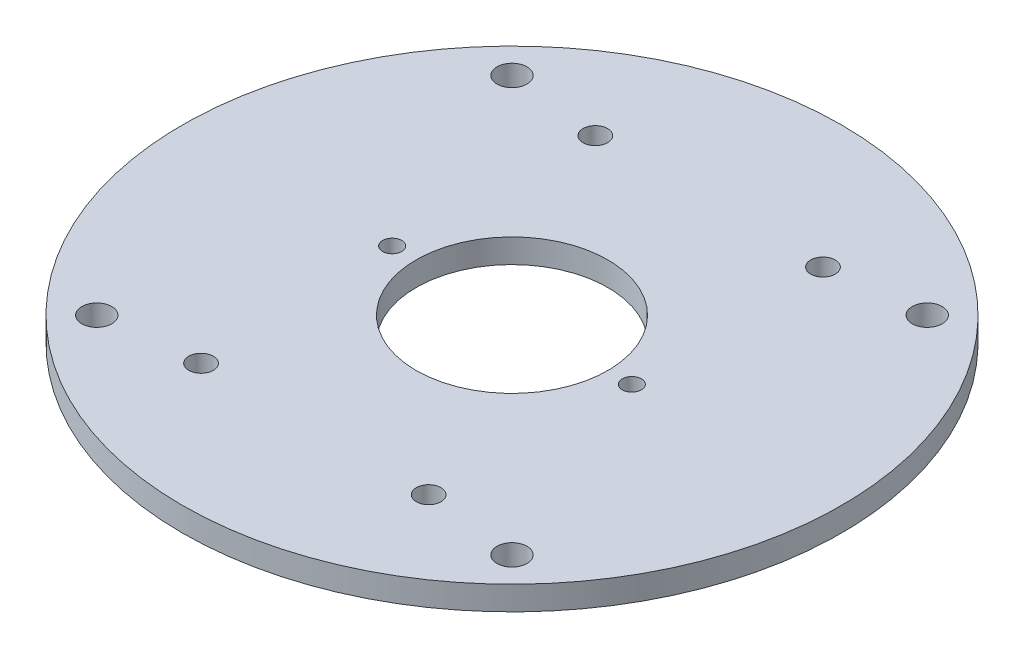
ISO-10303-21;
HEADER;
FILE_DESCRIPTION(('STEP AP214'),'2;1');
FILE_NAME('part.step','',(''),(''),'','','');
FILE_SCHEMA(('AUTOMOTIVE_DESIGN { 1 0 10303 214 1 1 1 1 }'));
ENDSEC;
DATA;
#1=APPLICATION_CONTEXT('core data for automotive mechanical design processes');
#2=APPLICATION_PROTOCOL_DEFINITION('international standard','automotive_design',2000,#1);
#3=PRODUCT_CONTEXT('',#1,'mechanical');
#4=PRODUCT('Part','Part','',(#3));
#5=PRODUCT_RELATED_PRODUCT_CATEGORY('part','',(#4));
#6=PRODUCT_DEFINITION_FORMATION('','',#4);
#7=PRODUCT_DEFINITION_CONTEXT('part definition',#1,'design');
#8=PRODUCT_DEFINITION('design','',#6,#7);
#9=PRODUCT_DEFINITION_SHAPE('','',#8);
#10=(LENGTH_UNIT() NAMED_UNIT(*) SI_UNIT(.MILLI.,.METRE.));
#11=(NAMED_UNIT(*) PLANE_ANGLE_UNIT() SI_UNIT($,.RADIAN.));
#12=(NAMED_UNIT(*) SI_UNIT($,.STERADIAN.) SOLID_ANGLE_UNIT());
#13=UNCERTAINTY_MEASURE_WITH_UNIT(LENGTH_MEASURE(1.E-05),#10,'distance_accuracy_value','');
#14=(GEOMETRIC_REPRESENTATION_CONTEXT(3) GLOBAL_UNCERTAINTY_ASSIGNED_CONTEXT((#13)) GLOBAL_UNIT_ASSIGNED_CONTEXT((#10,
#11,#12)) REPRESENTATION_CONTEXT('',''));
#15=CARTESIAN_POINT('',(0.,0.,0.));
#16=DIRECTION('',(0.,0.,1.));
#17=DIRECTION('',(1.,0.,0.));
#18=AXIS2_PLACEMENT_3D('',#15,#16,#17);
#19=CARTESIAN_POINT('',(0.,2.,0.));
#20=DIRECTION('',(0.,-1.,0.));
#21=DIRECTION('',(0.,0.,-1.));
#22=AXIS2_PLACEMENT_3D('',#19,#20,#21);
#23=CYLINDRICAL_SURFACE('',#22,27.5);
#24=CARTESIAN_POINT('',(0.,2.,0.));
#25=DIRECTION('',(0.,1.,0.));
#26=DIRECTION('',(0.,0.,1.));
#27=AXIS2_PLACEMENT_3D('',#24,#25,#26);
#28=CIRCLE('',#27,27.5);
#29=CARTESIAN_POINT('',(0.,2.,27.5));
#30=VERTEX_POINT('',#29);
#31=EDGE_CURVE('E10',#30,#30,#28,.T.);
#32=ORIENTED_EDGE('',*,*,#31,.F.);
#33=EDGE_LOOP('',(#32));
#34=FACE_BOUND('',#33,.T.);
#35=CARTESIAN_POINT('',(0.,0.,0.));
#36=DIRECTION('',(0.,1.,0.));
#37=DIRECTION('',(0.,0.,1.));
#38=AXIS2_PLACEMENT_3D('',#35,#36,#37);
#39=CIRCLE('',#38,27.5);
#40=CARTESIAN_POINT('',(0.,0.,27.5));
#41=VERTEX_POINT('',#40);
#42=EDGE_CURVE('E37',#41,#41,#39,.T.);
#43=ORIENTED_EDGE('',*,*,#42,.T.);
#44=EDGE_LOOP('',(#43));
#45=FACE_BOUND('',#44,.T.);
#46=ADVANCED_FACE('F34',(#34,#45),#23,.T.);
#47=CARTESIAN_POINT('',(0.,2.,0.));
#48=DIRECTION('',(0.,1.,0.));
#49=DIRECTION('',(0.,0.,1.));
#50=AXIS2_PLACEMENT_3D('',#47,#48,#49);
#51=PLANE('',#50);
#52=CARTESIAN_POINT('',(-9.49708846877382,2.,16.4516810878488));
#53=DIRECTION('',(0.,1.,0.));
#54=DIRECTION('',(0.,0.,1.));
#55=AXIS2_PLACEMENT_3D('',#52,#53,#54);
#56=CIRCLE('',#55,1.025);
#57=CARTESIAN_POINT('',(-9.49708846877382,2.,17.4766810878488));
#58=VERTEX_POINT('',#57);
#59=EDGE_CURVE('E108',#58,#58,#56,.T.);
#60=ORIENTED_EDGE('',*,*,#59,.F.);
#61=EDGE_LOOP('',(#60));
#62=FACE_BOUND('',#61,.T.);
#63=CARTESIAN_POINT('',(9.49708846877383,2.,16.4516810878489));
#64=DIRECTION('',(0.,1.,0.));
#65=DIRECTION('',(0.,0.,1.));
#66=AXIS2_PLACEMENT_3D('',#63,#64,#65);
#67=CIRCLE('',#66,1.025);
#68=CARTESIAN_POINT('',(9.49708846877383,2.,17.4766810878488));
#69=VERTEX_POINT('',#68);
#70=EDGE_CURVE('E102',#69,#69,#67,.T.);
#71=ORIENTED_EDGE('',*,*,#70,.F.);
#72=EDGE_LOOP('',(#71));
#73=FACE_BOUND('',#72,.T.);
#74=CARTESIAN_POINT('',(-9.49708846877382,2.,-16.4516810878488));
#75=DIRECTION('',(0.,1.,0.));
#76=DIRECTION('',(0.,0.,1.));
#77=AXIS2_PLACEMENT_3D('',#74,#75,#76);
#78=CIRCLE('',#77,1.025);
#79=CARTESIAN_POINT('',(-9.49708846877382,2.,-15.4266810878488));
#80=VERTEX_POINT('',#79);
#81=EDGE_CURVE('E96',#80,#80,#78,.T.);
#82=ORIENTED_EDGE('',*,*,#81,.F.);
#83=EDGE_LOOP('',(#82));
#84=FACE_BOUND('',#83,.T.);
#85=CARTESIAN_POINT('',(9.49708846877383,2.,-16.4516810878489));
#86=DIRECTION('',(0.,1.,0.));
#87=DIRECTION('',(0.,0.,1.));
#88=AXIS2_PLACEMENT_3D('',#85,#86,#87);
#89=CIRCLE('',#88,1.025);
#90=CARTESIAN_POINT('',(9.49708846877383,2.,-15.4266810878488));
#91=VERTEX_POINT('',#90);
#92=EDGE_CURVE('E90',#91,#91,#89,.T.);
#93=ORIENTED_EDGE('',*,*,#92,.F.);
#94=EDGE_LOOP('',(#93));
#95=FACE_BOUND('',#94,.T.);
#96=CARTESIAN_POINT('',(10.,2.,0.));
#97=DIRECTION('',(0.,1.,0.));
#98=DIRECTION('',(0.,0.,1.));
#99=AXIS2_PLACEMENT_3D('',#96,#97,#98);
#100=CIRCLE('',#99,0.8);
#101=CARTESIAN_POINT('',(10.,2.,0.8));
#102=VERTEX_POINT('',#101);
#103=EDGE_CURVE('E84',#102,#102,#100,.T.);
#104=ORIENTED_EDGE('',*,*,#103,.F.);
#105=EDGE_LOOP('',(#104));
#106=FACE_BOUND('',#105,.T.);
#107=CARTESIAN_POINT('',(-17.3241161390703,2.,17.3241161390705));
#108=DIRECTION('',(0.,1.,0.));
#109=DIRECTION('',(0.,0.,1.));
#110=AXIS2_PLACEMENT_3D('',#107,#108,#109);
#111=CIRCLE('',#110,1.24999999999999);
#112=CARTESIAN_POINT('',(-17.3241161390703,2.,18.5741161390705));
#113=VERTEX_POINT('',#112);
#114=EDGE_CURVE('E78',#113,#113,#111,.T.);
#115=ORIENTED_EDGE('',*,*,#114,.F.);
#116=EDGE_LOOP('',(#115));
#117=FACE_BOUND('',#116,.T.);
#118=CARTESIAN_POINT('',(17.3241161390703,2.,17.3241161390705));
#119=DIRECTION('',(0.,1.,0.));
#120=DIRECTION('',(0.,0.,1.));
#121=AXIS2_PLACEMENT_3D('',#118,#119,#120);
#122=CIRCLE('',#121,1.24999999999999);
#123=CARTESIAN_POINT('',(17.3241161390703,2.,18.5741161390705));
#124=VERTEX_POINT('',#123);
#125=EDGE_CURVE('E72',#124,#124,#122,.T.);
#126=ORIENTED_EDGE('',*,*,#125,.F.);
#127=EDGE_LOOP('',(#126));
#128=FACE_BOUND('',#127,.T.);
#129=CARTESIAN_POINT('',(17.3241161390703,2.,-17.3241161390705));
#130=DIRECTION('',(0.,1.,0.));
#131=DIRECTION('',(0.,0.,1.));
#132=AXIS2_PLACEMENT_3D('',#129,#130,#131);
#133=CIRCLE('',#132,1.24999999999999);
#134=CARTESIAN_POINT('',(17.3241161390703,2.,-16.0741161390705));
#135=VERTEX_POINT('',#134);
#136=EDGE_CURVE('E66',#135,#135,#133,.T.);
#137=ORIENTED_EDGE('',*,*,#136,.F.);
#138=EDGE_LOOP('',(#137));
#139=FACE_BOUND('',#138,.T.);
#140=CARTESIAN_POINT('',(-17.3241161390703,2.,-17.3241161390705));
#141=DIRECTION('',(0.,1.,0.));
#142=DIRECTION('',(0.,0.,1.));
#143=AXIS2_PLACEMENT_3D('',#140,#141,#142);
#144=CIRCLE('',#143,1.24999999999999);
#145=CARTESIAN_POINT('',(-17.3241161390703,2.,-16.0741161390705));
#146=VERTEX_POINT('',#145);
#147=EDGE_CURVE('E60',#146,#146,#144,.T.);
#148=ORIENTED_EDGE('',*,*,#147,.F.);
#149=EDGE_LOOP('',(#148));
#150=FACE_BOUND('',#149,.T.);
#151=CARTESIAN_POINT('',(-10.,2.,0.));
#152=DIRECTION('',(0.,1.,0.));
#153=DIRECTION('',(0.,0.,1.));
#154=AXIS2_PLACEMENT_3D('',#151,#152,#153);
#155=CIRCLE('',#154,0.8);
#156=CARTESIAN_POINT('',(-10.,2.,0.8));
#157=VERTEX_POINT('',#156);
#158=EDGE_CURVE('E54',#157,#157,#155,.T.);
#159=ORIENTED_EDGE('',*,*,#158,.F.);
#160=EDGE_LOOP('',(#159));
#161=FACE_BOUND('',#160,.T.);
#162=CARTESIAN_POINT('',(0.,2.,0.));
#163=DIRECTION('',(0.,1.,0.));
#164=DIRECTION('',(0.,0.,1.));
#165=AXIS2_PLACEMENT_3D('',#162,#163,#164);
#166=CIRCLE('',#165,8.);
#167=CARTESIAN_POINT('',(0.,2.,8.));
#168=VERTEX_POINT('',#167);
#169=EDGE_CURVE('E46',#168,#168,#166,.T.);
#170=ORIENTED_EDGE('',*,*,#169,.F.);
#171=EDGE_LOOP('',(#170));
#172=FACE_BOUND('',#171,.T.);
#173=ORIENTED_EDGE('',*,*,#31,.T.);
#174=EDGE_LOOP('',(#173));
#175=FACE_BOUND('',#174,.T.);
#176=ADVANCED_FACE('F114',(#62,#73,#84,#95,#106,#117,#128,#139,#150,#161,#172,#175),#51,.T.);
#177=CARTESIAN_POINT('',(0.,0.,0.));
#178=DIRECTION('',(0.,1.,0.));
#179=DIRECTION('',(0.,0.,1.));
#180=AXIS2_PLACEMENT_3D('',#177,#178,#179);
#181=PLANE('',#180);
#182=CARTESIAN_POINT('',(-9.49708846877382,0.,16.4516810878488));
#183=DIRECTION('',(0.,1.,0.));
#184=DIRECTION('',(0.,0.,1.));
#185=AXIS2_PLACEMENT_3D('',#182,#183,#184);
#186=CIRCLE('',#185,1.025);
#187=CARTESIAN_POINT('',(-9.49708846877382,0.,17.4766810878488));
#188=VERTEX_POINT('',#187);
#189=EDGE_CURVE('E105',#188,#188,#186,.T.);
#190=ORIENTED_EDGE('',*,*,#189,.T.);
#191=EDGE_LOOP('',(#190));
#192=FACE_BOUND('',#191,.T.);
#193=CARTESIAN_POINT('',(9.49708846877383,0.,16.4516810878489));
#194=DIRECTION('',(0.,1.,0.));
#195=DIRECTION('',(0.,0.,1.));
#196=AXIS2_PLACEMENT_3D('',#193,#194,#195);
#197=CIRCLE('',#196,1.025);
#198=CARTESIAN_POINT('',(9.49708846877383,0.,17.4766810878488));
#199=VERTEX_POINT('',#198);
#200=EDGE_CURVE('E99',#199,#199,#197,.T.);
#201=ORIENTED_EDGE('',*,*,#200,.T.);
#202=EDGE_LOOP('',(#201));
#203=FACE_BOUND('',#202,.T.);
#204=CARTESIAN_POINT('',(-9.49708846877382,0.,-16.4516810878488));
#205=DIRECTION('',(0.,1.,0.));
#206=DIRECTION('',(0.,0.,1.));
#207=AXIS2_PLACEMENT_3D('',#204,#205,#206);
#208=CIRCLE('',#207,1.025);
#209=CARTESIAN_POINT('',(-9.49708846877382,0.,-15.4266810878488));
#210=VERTEX_POINT('',#209);
#211=EDGE_CURVE('E93',#210,#210,#208,.T.);
#212=ORIENTED_EDGE('',*,*,#211,.T.);
#213=EDGE_LOOP('',(#212));
#214=FACE_BOUND('',#213,.T.);
#215=CARTESIAN_POINT('',(9.49708846877383,0.,-16.4516810878489));
#216=DIRECTION('',(0.,1.,0.));
#217=DIRECTION('',(0.,0.,1.));
#218=AXIS2_PLACEMENT_3D('',#215,#216,#217);
#219=CIRCLE('',#218,1.025);
#220=CARTESIAN_POINT('',(9.49708846877383,0.,-15.4266810878488));
#221=VERTEX_POINT('',#220);
#222=EDGE_CURVE('E87',#221,#221,#219,.T.);
#223=ORIENTED_EDGE('',*,*,#222,.T.);
#224=EDGE_LOOP('',(#223));
#225=FACE_BOUND('',#224,.T.);
#226=CARTESIAN_POINT('',(10.,0.,0.));
#227=DIRECTION('',(0.,1.,0.));
#228=DIRECTION('',(0.,0.,1.));
#229=AXIS2_PLACEMENT_3D('',#226,#227,#228);
#230=CIRCLE('',#229,0.8);
#231=CARTESIAN_POINT('',(10.,0.,0.8));
#232=VERTEX_POINT('',#231);
#233=EDGE_CURVE('E81',#232,#232,#230,.T.);
#234=ORIENTED_EDGE('',*,*,#233,.T.);
#235=EDGE_LOOP('',(#234));
#236=FACE_BOUND('',#235,.T.);
#237=CARTESIAN_POINT('',(-17.3241161390703,0.,17.3241161390705));
#238=DIRECTION('',(0.,1.,0.));
#239=DIRECTION('',(0.,0.,1.));
#240=AXIS2_PLACEMENT_3D('',#237,#238,#239);
#241=CIRCLE('',#240,1.25);
#242=CARTESIAN_POINT('',(-17.3241161390703,0.,18.5741161390705));
#243=VERTEX_POINT('',#242);
#244=EDGE_CURVE('E75',#243,#243,#241,.T.);
#245=ORIENTED_EDGE('',*,*,#244,.T.);
#246=EDGE_LOOP('',(#245));
#247=FACE_BOUND('',#246,.T.);
#248=CARTESIAN_POINT('',(17.3241161390703,0.,17.3241161390705));
#249=DIRECTION('',(0.,1.,0.));
#250=DIRECTION('',(0.,0.,1.));
#251=AXIS2_PLACEMENT_3D('',#248,#249,#250);
#252=CIRCLE('',#251,1.25);
#253=CARTESIAN_POINT('',(17.3241161390703,0.,18.5741161390705));
#254=VERTEX_POINT('',#253);
#255=EDGE_CURVE('E69',#254,#254,#252,.T.);
#256=ORIENTED_EDGE('',*,*,#255,.T.);
#257=EDGE_LOOP('',(#256));
#258=FACE_BOUND('',#257,.T.);
#259=CARTESIAN_POINT('',(17.3241161390703,0.,-17.3241161390705));
#260=DIRECTION('',(0.,1.,0.));
#261=DIRECTION('',(0.,0.,1.));
#262=AXIS2_PLACEMENT_3D('',#259,#260,#261);
#263=CIRCLE('',#262,1.25);
#264=CARTESIAN_POINT('',(17.3241161390703,0.,-16.0741161390705));
#265=VERTEX_POINT('',#264);
#266=EDGE_CURVE('E63',#265,#265,#263,.T.);
#267=ORIENTED_EDGE('',*,*,#266,.T.);
#268=EDGE_LOOP('',(#267));
#269=FACE_BOUND('',#268,.T.);
#270=CARTESIAN_POINT('',(-17.3241161390703,0.,-17.3241161390705));
#271=DIRECTION('',(0.,1.,0.));
#272=DIRECTION('',(0.,0.,1.));
#273=AXIS2_PLACEMENT_3D('',#270,#271,#272);
#274=CIRCLE('',#273,1.25);
#275=CARTESIAN_POINT('',(-17.3241161390703,0.,-16.0741161390705));
#276=VERTEX_POINT('',#275);
#277=EDGE_CURVE('E57',#276,#276,#274,.T.);
#278=ORIENTED_EDGE('',*,*,#277,.T.);
#279=EDGE_LOOP('',(#278));
#280=FACE_BOUND('',#279,.T.);
#281=CARTESIAN_POINT('',(-10.,0.,0.));
#282=DIRECTION('',(0.,1.,0.));
#283=DIRECTION('',(0.,0.,1.));
#284=AXIS2_PLACEMENT_3D('',#281,#282,#283);
#285=CIRCLE('',#284,0.8);
#286=CARTESIAN_POINT('',(-10.,0.,0.8));
#287=VERTEX_POINT('',#286);
#288=EDGE_CURVE('E49',#287,#287,#285,.T.);
#289=ORIENTED_EDGE('',*,*,#288,.T.);
#290=EDGE_LOOP('',(#289));
#291=FACE_BOUND('',#290,.T.);
#292=CARTESIAN_POINT('',(0.,0.,0.));
#293=DIRECTION('',(0.,1.,0.));
#294=DIRECTION('',(0.,0.,1.));
#295=AXIS2_PLACEMENT_3D('',#292,#293,#294);
#296=CIRCLE('',#295,8.);
#297=CARTESIAN_POINT('',(0.,0.,8.));
#298=VERTEX_POINT('',#297);
#299=EDGE_CURVE('E44',#298,#298,#296,.T.);
#300=ORIENTED_EDGE('',*,*,#299,.T.);
#301=EDGE_LOOP('',(#300));
#302=FACE_BOUND('',#301,.T.);
#303=ORIENTED_EDGE('',*,*,#42,.F.);
#304=EDGE_LOOP('',(#303));
#305=FACE_BOUND('',#304,.T.);
#306=ADVANCED_FACE('F117',(#192,#203,#214,#225,#236,#247,#258,#269,#280,#291,#302,#305),#181,.F.);
#307=CARTESIAN_POINT('',(0.,0.,0.));
#308=DIRECTION('',(0.,1.,0.));
#309=DIRECTION('',(0.,0.,1.));
#310=AXIS2_PLACEMENT_3D('',#307,#308,#309);
#311=CYLINDRICAL_SURFACE('',#310,8.);
#312=ORIENTED_EDGE('',*,*,#299,.F.);
#313=EDGE_LOOP('',(#312));
#314=FACE_BOUND('',#313,.T.);
#315=ORIENTED_EDGE('',*,*,#169,.T.);
#316=EDGE_LOOP('',(#315));
#317=FACE_BOUND('',#316,.T.);
#318=ADVANCED_FACE('F139',(#314,#317),#311,.F.);
#319=CARTESIAN_POINT('',(-10.,2.,0.));
#320=DIRECTION('',(0.,1.,0.));
#321=DIRECTION('',(0.,0.,1.));
#322=AXIS2_PLACEMENT_3D('',#319,#320,#321);
#323=CYLINDRICAL_SURFACE('',#322,0.8);
#324=ORIENTED_EDGE('',*,*,#288,.F.);
#325=EDGE_LOOP('',(#324));
#326=FACE_BOUND('',#325,.T.);
#327=ORIENTED_EDGE('',*,*,#158,.T.);
#328=EDGE_LOOP('',(#327));
#329=FACE_BOUND('',#328,.T.);
#330=ADVANCED_FACE('F141',(#326,#329),#323,.F.);
#331=CARTESIAN_POINT('',(-17.3241161390703,2.,-17.3241161390705));
#332=DIRECTION('',(0.,1.,0.));
#333=DIRECTION('',(0.,0.,1.));
#334=AXIS2_PLACEMENT_3D('',#331,#332,#333);
#335=CYLINDRICAL_SURFACE('',#334,1.24999999999999);
#336=ORIENTED_EDGE('',*,*,#277,.F.);
#337=EDGE_LOOP('',(#336));
#338=FACE_BOUND('',#337,.T.);
#339=ORIENTED_EDGE('',*,*,#147,.T.);
#340=EDGE_LOOP('',(#339));
#341=FACE_BOUND('',#340,.T.);
#342=ADVANCED_FACE('F148',(#338,#341),#335,.F.);
#343=CARTESIAN_POINT('',(17.3241161390703,2.,-17.3241161390705));
#344=DIRECTION('',(0.,1.,0.));
#345=DIRECTION('',(0.,0.,1.));
#346=AXIS2_PLACEMENT_3D('',#343,#344,#345);
#347=CYLINDRICAL_SURFACE('',#346,1.24999999999999);
#348=ORIENTED_EDGE('',*,*,#266,.F.);
#349=EDGE_LOOP('',(#348));
#350=FACE_BOUND('',#349,.T.);
#351=ORIENTED_EDGE('',*,*,#136,.T.);
#352=EDGE_LOOP('',(#351));
#353=FACE_BOUND('',#352,.T.);
#354=ADVANCED_FACE('F234',(#350,#353),#347,.F.);
#355=CARTESIAN_POINT('',(17.3241161390703,2.,17.3241161390705));
#356=DIRECTION('',(0.,1.,0.));
#357=DIRECTION('',(0.,0.,1.));
#358=AXIS2_PLACEMENT_3D('',#355,#356,#357);
#359=CYLINDRICAL_SURFACE('',#358,1.24999999999999);
#360=ORIENTED_EDGE('',*,*,#255,.F.);
#361=EDGE_LOOP('',(#360));
#362=FACE_BOUND('',#361,.T.);
#363=ORIENTED_EDGE('',*,*,#125,.T.);
#364=EDGE_LOOP('',(#363));
#365=FACE_BOUND('',#364,.T.);
#366=ADVANCED_FACE('F229',(#362,#365),#359,.F.);
#367=CARTESIAN_POINT('',(-17.3241161390703,2.,17.3241161390705));
#368=DIRECTION('',(0.,1.,0.));
#369=DIRECTION('',(0.,0.,1.));
#370=AXIS2_PLACEMENT_3D('',#367,#368,#369);
#371=CYLINDRICAL_SURFACE('',#370,1.24999999999999);
#372=ORIENTED_EDGE('',*,*,#244,.F.);
#373=EDGE_LOOP('',(#372));
#374=FACE_BOUND('',#373,.T.);
#375=ORIENTED_EDGE('',*,*,#114,.T.);
#376=EDGE_LOOP('',(#375));
#377=FACE_BOUND('',#376,.T.);
#378=ADVANCED_FACE('F221',(#374,#377),#371,.F.);
#379=CARTESIAN_POINT('',(10.,2.,0.));
#380=DIRECTION('',(0.,1.,0.));
#381=DIRECTION('',(0.,0.,1.));
#382=AXIS2_PLACEMENT_3D('',#379,#380,#381);
#383=CYLINDRICAL_SURFACE('',#382,0.8);
#384=ORIENTED_EDGE('',*,*,#233,.F.);
#385=EDGE_LOOP('',(#384));
#386=FACE_BOUND('',#385,.T.);
#387=ORIENTED_EDGE('',*,*,#103,.T.);
#388=EDGE_LOOP('',(#387));
#389=FACE_BOUND('',#388,.T.);
#390=ADVANCED_FACE('F211',(#386,#389),#383,.F.);
#391=CARTESIAN_POINT('',(9.49708846877383,2.,-16.4516810878489));
#392=DIRECTION('',(0.,1.,0.));
#393=DIRECTION('',(0.,0.,1.));
#394=AXIS2_PLACEMENT_3D('',#391,#392,#393);
#395=CYLINDRICAL_SURFACE('',#394,1.025);
#396=ORIENTED_EDGE('',*,*,#222,.F.);
#397=EDGE_LOOP('',(#396));
#398=FACE_BOUND('',#397,.T.);
#399=ORIENTED_EDGE('',*,*,#92,.T.);
#400=EDGE_LOOP('',(#399));
#401=FACE_BOUND('',#400,.T.);
#402=ADVANCED_FACE('F202',(#398,#401),#395,.F.);
#403=CARTESIAN_POINT('',(-9.49708846877382,2.,-16.4516810878488));
#404=DIRECTION('',(0.,1.,0.));
#405=DIRECTION('',(0.,0.,1.));
#406=AXIS2_PLACEMENT_3D('',#403,#404,#405);
#407=CYLINDRICAL_SURFACE('',#406,1.025);
#408=ORIENTED_EDGE('',*,*,#211,.F.);
#409=EDGE_LOOP('',(#408));
#410=FACE_BOUND('',#409,.T.);
#411=ORIENTED_EDGE('',*,*,#81,.T.);
#412=EDGE_LOOP('',(#411));
#413=FACE_BOUND('',#412,.T.);
#414=ADVANCED_FACE('F181',(#410,#413),#407,.F.);
#415=CARTESIAN_POINT('',(9.49708846877383,2.,16.4516810878489));
#416=DIRECTION('',(0.,1.,0.));
#417=DIRECTION('',(0.,0.,1.));
#418=AXIS2_PLACEMENT_3D('',#415,#416,#417);
#419=CYLINDRICAL_SURFACE('',#418,1.025);
#420=ORIENTED_EDGE('',*,*,#200,.F.);
#421=EDGE_LOOP('',(#420));
#422=FACE_BOUND('',#421,.T.);
#423=ORIENTED_EDGE('',*,*,#70,.T.);
#424=EDGE_LOOP('',(#423));
#425=FACE_BOUND('',#424,.T.);
#426=ADVANCED_FACE('F175',(#422,#425),#419,.F.);
#427=CARTESIAN_POINT('',(-9.49708846877382,2.,16.4516810878488));
#428=DIRECTION('',(0.,1.,0.));
#429=DIRECTION('',(0.,0.,1.));
#430=AXIS2_PLACEMENT_3D('',#427,#428,#429);
#431=CYLINDRICAL_SURFACE('',#430,1.025);
#432=ORIENTED_EDGE('',*,*,#189,.F.);
#433=EDGE_LOOP('',(#432));
#434=FACE_BOUND('',#433,.T.);
#435=ORIENTED_EDGE('',*,*,#59,.T.);
#436=EDGE_LOOP('',(#435));
#437=FACE_BOUND('',#436,.T.);
#438=ADVANCED_FACE('F112',(#434,#437),#431,.F.);
#439=CLOSED_SHELL('',(#46,#176,#306,#318,#330,#342,#354,#366,#378,#390,#402,#414,#426,#438));
#440=MANIFOLD_SOLID_BREP('B2',#439);
#441=ADVANCED_BREP_SHAPE_REPRESENTATION('',(#18,#440),#14);
#442=SHAPE_DEFINITION_REPRESENTATION(#9,#441);
ENDSEC;
END-ISO-10303-21;
